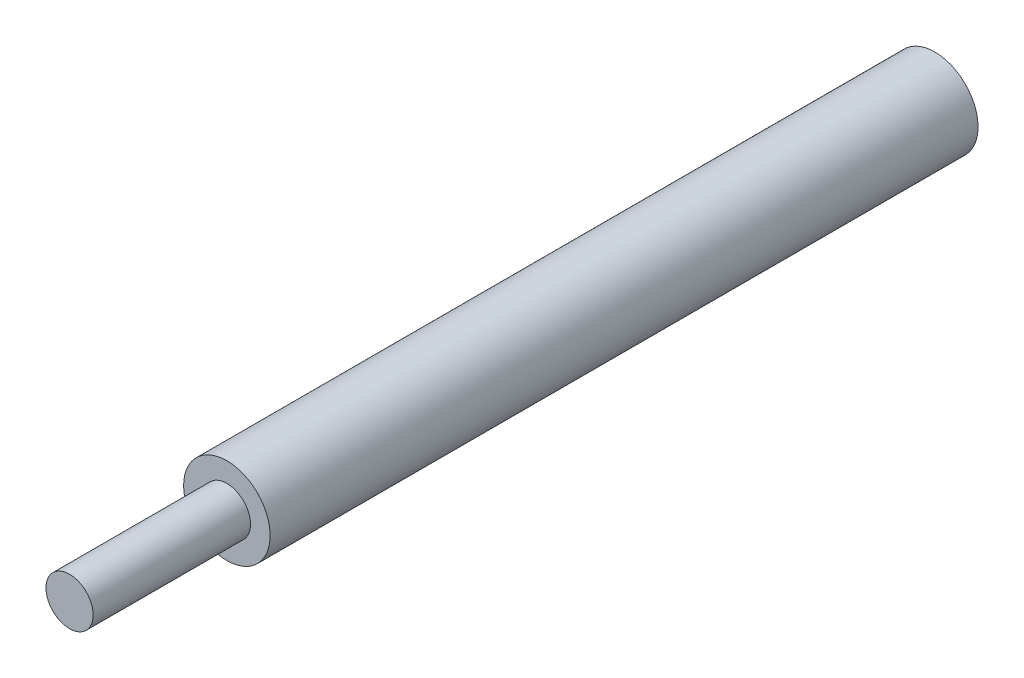
ISO-10303-21;
HEADER;
FILE_DESCRIPTION(('STEP AP214'),'2;1');
FILE_NAME('part.step','',(''),(''),'','','');
FILE_SCHEMA(('AUTOMOTIVE_DESIGN { 1 0 10303 214 1 1 1 1 }'));
ENDSEC;
DATA;
#1=APPLICATION_CONTEXT('core data for automotive mechanical design processes');
#2=APPLICATION_PROTOCOL_DEFINITION('international standard','automotive_design',2000,#1);
#3=PRODUCT_CONTEXT('',#1,'mechanical');
#4=PRODUCT('Part','Part','',(#3));
#5=PRODUCT_RELATED_PRODUCT_CATEGORY('part','',(#4));
#6=PRODUCT_DEFINITION_FORMATION('','',#4);
#7=PRODUCT_DEFINITION_CONTEXT('part definition',#1,'design');
#8=PRODUCT_DEFINITION('design','',#6,#7);
#9=PRODUCT_DEFINITION_SHAPE('','',#8);
#10=(LENGTH_UNIT() NAMED_UNIT(*) SI_UNIT(.MILLI.,.METRE.));
#11=(NAMED_UNIT(*) PLANE_ANGLE_UNIT() SI_UNIT($,.RADIAN.));
#12=(NAMED_UNIT(*) SI_UNIT($,.STERADIAN.) SOLID_ANGLE_UNIT());
#13=UNCERTAINTY_MEASURE_WITH_UNIT(LENGTH_MEASURE(1.E-05),#10,'distance_accuracy_value','');
#14=(GEOMETRIC_REPRESENTATION_CONTEXT(3) GLOBAL_UNCERTAINTY_ASSIGNED_CONTEXT((#13)) GLOBAL_UNIT_ASSIGNED_CONTEXT((#10,
#11,#12)) REPRESENTATION_CONTEXT('',''));
#15=CARTESIAN_POINT('',(0.,0.,0.));
#16=DIRECTION('',(0.,0.,1.));
#17=DIRECTION('',(1.,0.,0.));
#18=AXIS2_PLACEMENT_3D('',#15,#16,#17);
#19=CARTESIAN_POINT('',(0.,0.,221.));
#20=DIRECTION('',(0.,0.,-1.));
#21=DIRECTION('',(-1.,0.,0.));
#22=AXIS2_PLACEMENT_3D('',#19,#20,#21);
#23=CYLINDRICAL_SURFACE('',#22,6.);
#24=CARTESIAN_POINT('',(0.,0.,180.));
#25=DIRECTION('',(0.,0.,1.));
#26=DIRECTION('',(1.,0.,0.));
#27=AXIS2_PLACEMENT_3D('',#24,#25,#26);
#28=CIRCLE('',#27,6.);
#29=CARTESIAN_POINT('',(6.,0.,180.));
#30=VERTEX_POINT('',#29);
#31=EDGE_CURVE('E11',#30,#30,#28,.T.);
#32=ORIENTED_EDGE('',*,*,#31,.T.);
#33=EDGE_LOOP('',(#32));
#34=FACE_BOUND('',#33,.T.);
#35=CARTESIAN_POINT('',(0.,0.,220.));
#36=DIRECTION('',(0.,0.,1.));
#37=DIRECTION('',(1.,0.,0.));
#38=AXIS2_PLACEMENT_3D('',#35,#36,#37);
#39=CIRCLE('',#38,6.);
#40=CARTESIAN_POINT('',(6.,0.,220.));
#41=VERTEX_POINT('',#40);
#42=EDGE_CURVE('E60',#41,#41,#39,.T.);
#43=ORIENTED_EDGE('',*,*,#42,.F.);
#44=EDGE_LOOP('',(#43));
#45=FACE_BOUND('',#44,.T.);
#46=ADVANCED_FACE('F38',(#34,#45),#23,.T.);
#47=CARTESIAN_POINT('',(0.,0.,180.));
#48=DIRECTION('',(0.,0.,-1.));
#49=DIRECTION('',(-1.,0.,0.));
#50=AXIS2_PLACEMENT_3D('',#47,#48,#49);
#51=CYLINDRICAL_SURFACE('',#50,11.);
#52=CARTESIAN_POINT('',(0.,0.,180.));
#53=DIRECTION('',(0.,0.,1.));
#54=DIRECTION('',(1.,0.,0.));
#55=AXIS2_PLACEMENT_3D('',#52,#53,#54);
#56=CIRCLE('',#55,11.);
#57=CARTESIAN_POINT('',(-11.,0.,180.));
#58=VERTEX_POINT('',#57);
#59=EDGE_CURVE('E46',#58,#58,#56,.T.);
#60=CARTESIAN_POINT('',(0.,0.,0.));
#61=DIRECTION('',(0.,0.,1.));
#62=DIRECTION('',(1.,0.,0.));
#63=AXIS2_PLACEMENT_3D('',#60,#61,#62);
#64=CIRCLE('',#63,11.);
#65=CARTESIAN_POINT('',(-11.,0.,0.));
#66=VERTEX_POINT('',#65);
#67=EDGE_CURVE('E42',#66,#66,#64,.T.);
#68=CARTESIAN_POINT('',(-11.,0.,180.));
#69=CARTESIAN_POINT('',(-11.,0.,178.125));
#70=CARTESIAN_POINT('',(-11.,0.,176.25));
#71=CARTESIAN_POINT('',(-11.,0.,172.5));
#72=CARTESIAN_POINT('',(-11.,0.,170.625));
#73=CARTESIAN_POINT('',(-11.,0.,166.875));
#74=CARTESIAN_POINT('',(-11.,0.,165.));
#75=CARTESIAN_POINT('',(-11.,0.,161.25));
#76=CARTESIAN_POINT('',(-11.,0.,159.375));
#77=CARTESIAN_POINT('',(-11.,0.,155.625));
#78=CARTESIAN_POINT('',(-11.,0.,153.75));
#79=CARTESIAN_POINT('',(-11.,0.,150.));
#80=CARTESIAN_POINT('',(-11.,0.,148.125));
#81=CARTESIAN_POINT('',(-11.,0.,144.375));
#82=CARTESIAN_POINT('',(-11.,0.,142.5));
#83=CARTESIAN_POINT('',(-11.,0.,138.75));
#84=CARTESIAN_POINT('',(-11.,0.,136.875));
#85=CARTESIAN_POINT('',(-11.,0.,133.125));
#86=CARTESIAN_POINT('',(-11.,0.,131.25));
#87=CARTESIAN_POINT('',(-11.,0.,127.5));
#88=CARTESIAN_POINT('',(-11.,0.,125.625));
#89=CARTESIAN_POINT('',(-11.,0.,121.875));
#90=CARTESIAN_POINT('',(-11.,0.,120.));
#91=CARTESIAN_POINT('',(-11.,0.,116.25));
#92=CARTESIAN_POINT('',(-11.,0.,114.375));
#93=CARTESIAN_POINT('',(-11.,0.,110.625));
#94=CARTESIAN_POINT('',(-11.,0.,108.75));
#95=CARTESIAN_POINT('',(-11.,0.,105.));
#96=CARTESIAN_POINT('',(-11.,0.,103.125));
#97=CARTESIAN_POINT('',(-11.,0.,99.375));
#98=CARTESIAN_POINT('',(-11.,0.,97.5));
#99=CARTESIAN_POINT('',(-11.,0.,93.75));
#100=CARTESIAN_POINT('',(-11.,0.,91.875));
#101=CARTESIAN_POINT('',(-11.,0.,88.125));
#102=CARTESIAN_POINT('',(-11.,0.,86.25));
#103=CARTESIAN_POINT('',(-11.,0.,82.5));
#104=CARTESIAN_POINT('',(-11.,0.,80.625));
#105=CARTESIAN_POINT('',(-11.,0.,76.875));
#106=CARTESIAN_POINT('',(-11.,0.,75.));
#107=CARTESIAN_POINT('',(-11.,0.,71.25));
#108=CARTESIAN_POINT('',(-11.,0.,69.375));
#109=CARTESIAN_POINT('',(-11.,0.,65.625));
#110=CARTESIAN_POINT('',(-11.,0.,63.75));
#111=CARTESIAN_POINT('',(-11.,0.,60.));
#112=CARTESIAN_POINT('',(-11.,0.,58.125));
#113=CARTESIAN_POINT('',(-11.,0.,54.375));
#114=CARTESIAN_POINT('',(-11.,0.,52.5));
#115=CARTESIAN_POINT('',(-11.,0.,48.75));
#116=CARTESIAN_POINT('',(-11.,0.,46.875));
#117=CARTESIAN_POINT('',(-11.,0.,43.125));
#118=CARTESIAN_POINT('',(-11.,0.,41.25));
#119=CARTESIAN_POINT('',(-11.,0.,37.5));
#120=CARTESIAN_POINT('',(-11.,0.,35.625));
#121=CARTESIAN_POINT('',(-11.,0.,31.875));
#122=CARTESIAN_POINT('',(-11.,0.,30.));
#123=CARTESIAN_POINT('',(-11.,0.,26.25));
#124=CARTESIAN_POINT('',(-11.,0.,24.375));
#125=CARTESIAN_POINT('',(-11.,0.,20.625));
#126=CARTESIAN_POINT('',(-11.,0.,18.75));
#127=CARTESIAN_POINT('',(-11.,0.,15.));
#128=CARTESIAN_POINT('',(-11.,0.,13.125));
#129=CARTESIAN_POINT('',(-11.,0.,9.37499999999998));
#130=CARTESIAN_POINT('',(-11.,0.,7.49999999999997));
#131=CARTESIAN_POINT('',(-11.,0.,3.74999999999997));
#132=CARTESIAN_POINT('',(-11.,0.,1.87499999999997));
#133=CARTESIAN_POINT('',(-11.,0.,0.));
#134=B_SPLINE_CURVE_WITH_KNOTS('',3,(#68,#69,#70,#71,#72,#73,#74,#75,#76,#77,#78,#79,#80,#81,
#82,#83,#84,#85,#86,#87,#88,#89,#90,#91,#92,#93,#94,#95,#96,#97,#98,#99,#100,#101,#102,#103,
#104,#105,#106,#107,#108,#109,#110,#111,#112,#113,#114,#115,#116,#117,#118,#119,#120,#121,#122,
#123,#124,#125,#126,#127,#128,#129,#130,#131,#132,#133),.UNSPECIFIED.,.F.,.F.,(4,2,2,2,2,2,2,2,
2,2,2,2,2,2,2,2,2,2,2,2,2,2,2,2,2,2,2,2,2,2,2,2,4),(0.,5.62500000000002,11.25,16.875,22.5,
28.125,33.75,39.375,45.,50.625,56.25,61.875,67.5,73.125,78.75,84.375,90.,95.625,101.25,106.875,
112.5,118.125,123.75,129.375,135.,140.625,146.25,151.875,157.5,163.125,168.75,174.375,180.),.UNSPECIFIED.);
#135=EDGE_CURVE('BSEAM40',#58,#66,#134,.T.);
#136=ORIENTED_EDGE('',*,*,#59,.F.);
#137=ORIENTED_EDGE('',*,*,#67,.T.);
#138=ORIENTED_EDGE('',*,*,#135,.T.);
#139=ORIENTED_EDGE('',*,*,#135,.F.);
#140=EDGE_LOOP('',(#136,#138,#137,#139));
#141=FACE_BOUND('',#140,.T.);
#142=ADVANCED_FACE('F40',(#141),#51,.T.);
#143=CARTESIAN_POINT('',(0.,0.,180.));
#144=DIRECTION('',(0.,0.,1.));
#145=DIRECTION('',(1.,0.,0.));
#146=AXIS2_PLACEMENT_3D('',#143,#144,#145);
#147=PLANE('',#146);
#148=ORIENTED_EDGE('',*,*,#31,.F.);
#149=EDGE_LOOP('',(#148));
#150=FACE_BOUND('',#149,.T.);
#151=ORIENTED_EDGE('',*,*,#59,.T.);
#152=EDGE_LOOP('',(#151));
#153=FACE_BOUND('',#152,.T.);
#154=ADVANCED_FACE('F76',(#150,#153),#147,.T.);
#155=CARTESIAN_POINT('',(0.,0.,0.));
#156=DIRECTION('',(0.,0.,1.));
#157=DIRECTION('',(1.,0.,0.));
#158=AXIS2_PLACEMENT_3D('',#155,#156,#157);
#159=PLANE('',#158);
#160=CARTESIAN_POINT('',(0.,0.,0.));
#161=DIRECTION('',(0.,0.,-1.));
#162=DIRECTION('',(-1.,0.,0.));
#163=AXIS2_PLACEMENT_3D('',#160,#161,#162);
#164=CIRCLE('',#163,3.5);
#165=CARTESIAN_POINT('',(-3.5,0.,0.));
#166=VERTEX_POINT('',#165);
#167=EDGE_CURVE('E61',#166,#166,#164,.T.);
#168=ORIENTED_EDGE('',*,*,#167,.F.);
#169=EDGE_LOOP('',(#168));
#170=FACE_BOUND('',#169,.T.);
#171=ORIENTED_EDGE('',*,*,#67,.F.);
#172=EDGE_LOOP('',(#171));
#173=FACE_BOUND('',#172,.T.);
#174=ADVANCED_FACE('F74',(#170,#173),#159,.F.);
#175=CARTESIAN_POINT('',(0.,0.,220.));
#176=DIRECTION('',(0.,0.,1.));
#177=DIRECTION('',(1.,0.,0.));
#178=AXIS2_PLACEMENT_3D('',#175,#176,#177);
#179=PLANE('',#178);
#180=ORIENTED_EDGE('',*,*,#42,.T.);
#181=EDGE_LOOP('',(#180));
#182=FACE_BOUND('',#181,.T.);
#183=ADVANCED_FACE('F54',(#182),#179,.T.);
#184=CARTESIAN_POINT('',(0.,0.,35.));
#185=DIRECTION('',(0.,0.,-1.));
#186=DIRECTION('',(-1.,0.,0.));
#187=AXIS2_PLACEMENT_3D('',#184,#185,#186);
#188=CONICAL_SURFACE('',#187,3.49999999999999,1.02974425867665);
#189=CARTESIAN_POINT('',(0.,0.,37.1030121665965));
#190=VERTEX_POINT('',#189);
#191=VERTEX_LOOP('',#190);
#192=FACE_BOUND('',#191,.T.);
#193=CARTESIAN_POINT('',(0.,0.,35.));
#194=DIRECTION('',(0.,0.,-1.));
#195=DIRECTION('',(-1.,0.,0.));
#196=AXIS2_PLACEMENT_3D('',#193,#194,#195);
#197=CIRCLE('',#196,3.49999999999999);
#198=CARTESIAN_POINT('',(-3.49999999999999,0.,35.));
#199=VERTEX_POINT('',#198);
#200=EDGE_CURVE('E58',#199,#199,#197,.T.);
#201=ORIENTED_EDGE('',*,*,#200,.T.);
#202=EDGE_LOOP('',(#201));
#203=FACE_BOUND('',#202,.T.);
#204=ADVANCED_FACE('F50',(#192,#203),#188,.F.);
#205=CARTESIAN_POINT('',(0.,0.,0.));
#206=DIRECTION('',(0.,0.,-1.));
#207=DIRECTION('',(-1.,0.,0.));
#208=AXIS2_PLACEMENT_3D('',#205,#206,#207);
#209=CYLINDRICAL_SURFACE('',#208,3.49999999999999);
#210=ORIENTED_EDGE('',*,*,#200,.F.);
#211=EDGE_LOOP('',(#210));
#212=FACE_BOUND('',#211,.T.);
#213=ORIENTED_EDGE('',*,*,#167,.T.);
#214=EDGE_LOOP('',(#213));
#215=FACE_BOUND('',#214,.T.);
#216=ADVANCED_FACE('F53',(#212,#215),#209,.F.);
#217=CLOSED_SHELL('',(#46,#142,#154,#174,#183,#204,#216));
#218=MANIFOLD_SOLID_BREP('B2',#217);
#219=ADVANCED_BREP_SHAPE_REPRESENTATION('',(#18,#218),#14);
#220=SHAPE_DEFINITION_REPRESENTATION(#9,#219);
ENDSEC;
END-ISO-10303-21;
